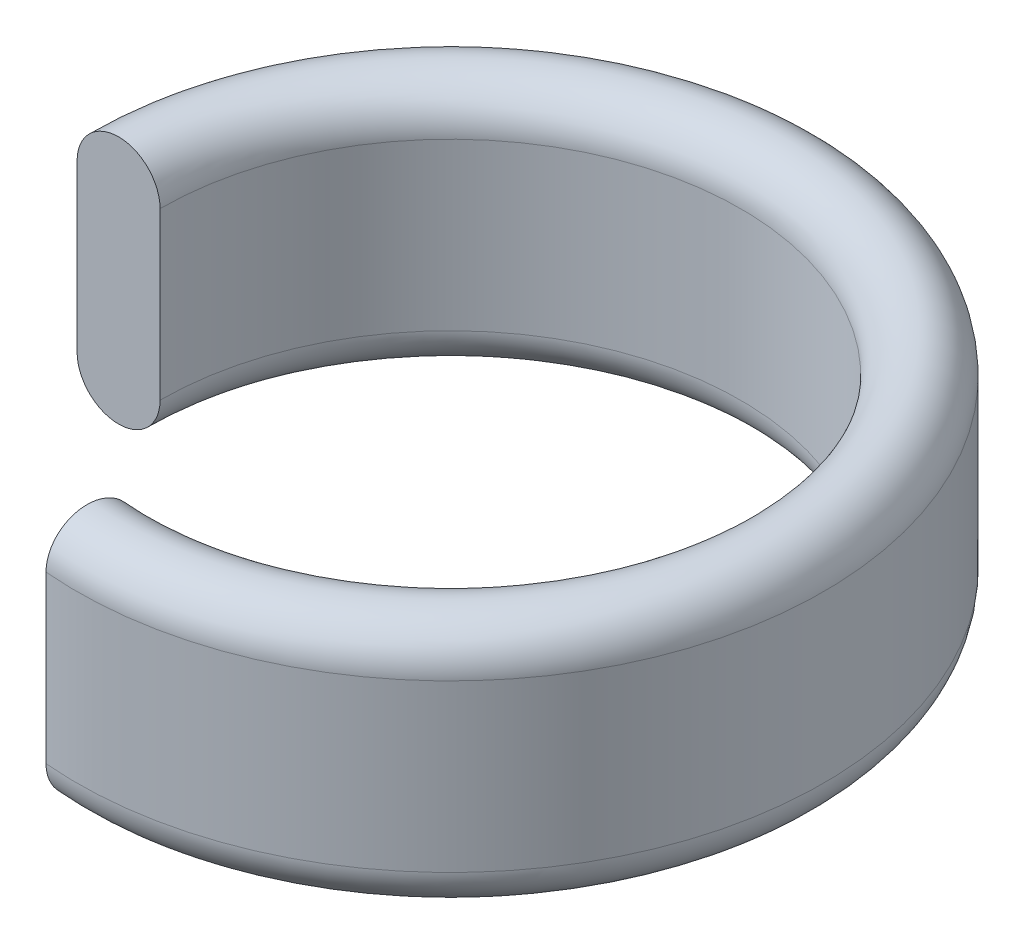
ISO-10303-21;
HEADER;
FILE_DESCRIPTION(('STEP AP214'),'2;1');
FILE_NAME('part.step','',(''),(''),'','','');
FILE_SCHEMA(('AUTOMOTIVE_DESIGN { 1 0 10303 214 1 1 1 1 }'));
ENDSEC;
DATA;
#1=APPLICATION_CONTEXT('core data for automotive mechanical design processes');
#2=APPLICATION_PROTOCOL_DEFINITION('international standard','automotive_design',2000,#1);
#3=PRODUCT_CONTEXT('',#1,'mechanical');
#4=PRODUCT('Part','Part','',(#3));
#5=PRODUCT_RELATED_PRODUCT_CATEGORY('part','',(#4));
#6=PRODUCT_DEFINITION_FORMATION('','',#4);
#7=PRODUCT_DEFINITION_CONTEXT('part definition',#1,'design');
#8=PRODUCT_DEFINITION('design','',#6,#7);
#9=PRODUCT_DEFINITION_SHAPE('','',#8);
#10=(LENGTH_UNIT() NAMED_UNIT(*) SI_UNIT(.MILLI.,.METRE.));
#11=(NAMED_UNIT(*) PLANE_ANGLE_UNIT() SI_UNIT($,.RADIAN.));
#12=(NAMED_UNIT(*) SI_UNIT($,.STERADIAN.) SOLID_ANGLE_UNIT());
#13=UNCERTAINTY_MEASURE_WITH_UNIT(LENGTH_MEASURE(1.E-05),#10,'distance_accuracy_value','');
#14=(GEOMETRIC_REPRESENTATION_CONTEXT(3) GLOBAL_UNCERTAINTY_ASSIGNED_CONTEXT((#13)) GLOBAL_UNIT_ASSIGNED_CONTEXT((#10,
#11,#12)) REPRESENTATION_CONTEXT('',''));
#15=CARTESIAN_POINT('',(0.,0.,0.));
#16=DIRECTION('',(0.,0.,1.));
#17=DIRECTION('',(1.,0.,0.));
#18=AXIS2_PLACEMENT_3D('',#15,#16,#17);
#19=CARTESIAN_POINT('',(0.,-5.,0.));
#20=DIRECTION('',(0.,1.,0.));
#21=DIRECTION('',(0.,0.,1.));
#22=AXIS2_PLACEMENT_3D('',#19,#20,#21);
#23=TOROIDAL_SURFACE('',#22,20.,2.5);
#24=CARTESIAN_POINT('',(0.,-5.,0.));
#25=DIRECTION('',(0.,1.,0.));
#26=DIRECTION('',(0.,0.,1.));
#27=AXIS2_PLACEMENT_3D('',#24,#25,#26);
#28=CIRCLE('',#27,22.5);
#29=CARTESIAN_POINT('',(-1.96100421182254,-5.,22.4143807070643));
#30=VERTEX_POINT('',#29);
#31=CARTESIAN_POINT('',(-22.5,-5.,0.));
#32=VERTEX_POINT('',#31);
#33=EDGE_CURVE('E13',#30,#32,#28,.T.);
#34=ORIENTED_EDGE('',*,*,#33,.F.);
#35=CARTESIAN_POINT('',(-1.74311485495337,-5.,19.9238939618349));
#36=DIRECTION('',(0.996194698091745,0.,0.0871557427476685));
#37=DIRECTION('',(-0.0871557427476685,0.,0.996194698091745));
#38=AXIS2_PLACEMENT_3D('',#35,#36,#37);
#39=CIRCLE('',#38,2.5);
#40=CARTESIAN_POINT('',(-1.5252254980842,-5.,17.4334072166055));
#41=VERTEX_POINT('',#40);
#42=EDGE_CURVE('E83',#30,#41,#39,.T.);
#43=ORIENTED_EDGE('',*,*,#42,.T.);
#44=CARTESIAN_POINT('',(0.,-5.,0.));
#45=DIRECTION('',(0.,1.,0.));
#46=DIRECTION('',(0.,0.,1.));
#47=AXIS2_PLACEMENT_3D('',#44,#45,#46);
#48=CIRCLE('',#47,17.5);
#49=CARTESIAN_POINT('',(-17.5,-5.,0.));
#50=VERTEX_POINT('',#49);
#51=EDGE_CURVE('E78',#41,#50,#48,.T.);
#52=ORIENTED_EDGE('',*,*,#51,.T.);
#53=CARTESIAN_POINT('',(-20.,-5.,0.));
#54=DIRECTION('',(0.,0.,1.));
#55=DIRECTION('',(-1.,0.,0.));
#56=AXIS2_PLACEMENT_3D('',#53,#54,#55);
#57=CIRCLE('',#56,2.5);
#58=EDGE_CURVE('E81',#32,#50,#57,.T.);
#59=ORIENTED_EDGE('',*,*,#58,.F.);
#60=EDGE_LOOP('',(#34,#43,#52,#59));
#61=FACE_BOUND('',#60,.T.);
#62=ADVANCED_FACE('F42',(#61),#23,.T.);
#63=CARTESIAN_POINT('',(0.,8.7572648493363,0.));
#64=DIRECTION('',(0.,1.,0.));
#65=DIRECTION('',(0.,0.,1.));
#66=AXIS2_PLACEMENT_3D('',#63,#64,#65);
#67=CYLINDRICAL_SURFACE('',#66,22.5);
#68=CARTESIAN_POINT('',(0.,5.,0.));
#69=DIRECTION('',(0.,1.,0.));
#70=DIRECTION('',(0.,0.,1.));
#71=AXIS2_PLACEMENT_3D('',#68,#69,#70);
#72=CIRCLE('',#71,22.5);
#73=CARTESIAN_POINT('',(-1.96100421182254,5.,22.4143807070643));
#74=VERTEX_POINT('',#73);
#75=CARTESIAN_POINT('',(-22.5,5.,0.));
#76=VERTEX_POINT('',#75);
#77=EDGE_CURVE('E50',#74,#76,#72,.T.);
#78=ORIENTED_EDGE('',*,*,#77,.F.);
#79=DIRECTION('',(0.,-1.,0.));
#80=VECTOR('',#79,1.);
#81=CARTESIAN_POINT('',(-1.96100421182254,-5.,22.4143807070643));
#82=LINE('',#81,#80);
#83=EDGE_CURVE('E88',#74,#30,#82,.T.);
#84=ORIENTED_EDGE('',*,*,#83,.T.);
#85=ORIENTED_EDGE('',*,*,#33,.T.);
#86=DIRECTION('',(0.,-1.,0.));
#87=VECTOR('',#86,1.);
#88=CARTESIAN_POINT('',(-22.5,-5.,0.));
#89=LINE('',#88,#87);
#90=EDGE_CURVE('E100',#76,#32,#89,.T.);
#91=ORIENTED_EDGE('',*,*,#90,.F.);
#92=EDGE_LOOP('',(#78,#84,#85,#91));
#93=FACE_BOUND('',#92,.T.);
#94=ADVANCED_FACE('F44',(#93),#67,.T.);
#95=CARTESIAN_POINT('',(0.,5.,0.));
#96=DIRECTION('',(0.,1.,0.));
#97=DIRECTION('',(0.,0.,1.));
#98=AXIS2_PLACEMENT_3D('',#95,#96,#97);
#99=TOROIDAL_SURFACE('',#98,20.,2.5);
#100=CARTESIAN_POINT('',(0.,5.,0.));
#101=DIRECTION('',(0.,1.,0.));
#102=DIRECTION('',(0.,0.,1.));
#103=AXIS2_PLACEMENT_3D('',#100,#101,#102);
#104=CIRCLE('',#103,17.5);
#105=CARTESIAN_POINT('',(-1.5252254980842,5.,17.4334072166055));
#106=VERTEX_POINT('',#105);
#107=CARTESIAN_POINT('',(-17.5,5.,0.));
#108=VERTEX_POINT('',#107);
#109=EDGE_CURVE('E87',#106,#108,#104,.T.);
#110=ORIENTED_EDGE('',*,*,#109,.F.);
#111=CARTESIAN_POINT('',(-1.74311485495337,5.,19.9238939618349));
#112=DIRECTION('',(0.996194698091745,0.,0.0871557427476685));
#113=DIRECTION('',(-0.0871557427476685,0.,0.996194698091745));
#114=AXIS2_PLACEMENT_3D('',#111,#112,#113);
#115=CIRCLE('',#114,2.5);
#116=EDGE_CURVE('E108',#106,#74,#115,.T.);
#117=ORIENTED_EDGE('',*,*,#116,.T.);
#118=ORIENTED_EDGE('',*,*,#77,.T.);
#119=CARTESIAN_POINT('',(-20.,5.,0.));
#120=DIRECTION('',(0.,0.,1.));
#121=DIRECTION('',(-1.,0.,0.));
#122=AXIS2_PLACEMENT_3D('',#119,#120,#121);
#123=CIRCLE('',#122,2.5);
#124=EDGE_CURVE('E96',#108,#76,#123,.T.);
#125=ORIENTED_EDGE('',*,*,#124,.F.);
#126=EDGE_LOOP('',(#110,#117,#118,#125));
#127=FACE_BOUND('',#126,.T.);
#128=ADVANCED_FACE('F112',(#127),#99,.T.);
#129=CARTESIAN_POINT('',(0.,8.7572648493363,0.));
#130=DIRECTION('',(0.,1.,0.));
#131=DIRECTION('',(0.,0.,1.));
#132=AXIS2_PLACEMENT_3D('',#129,#130,#131);
#133=CYLINDRICAL_SURFACE('',#132,17.5);
#134=DIRECTION('',(0.,1.,0.));
#135=VECTOR('',#134,1.);
#136=CARTESIAN_POINT('',(-1.5252254980842,-5.,17.4334072166055));
#137=LINE('',#136,#135);
#138=EDGE_CURVE('E106',#41,#106,#137,.T.);
#139=ORIENTED_EDGE('',*,*,#138,.T.);
#140=ORIENTED_EDGE('',*,*,#109,.T.);
#141=DIRECTION('',(0.,1.,0.));
#142=VECTOR('',#141,1.);
#143=CARTESIAN_POINT('',(-17.5,-5.,0.));
#144=LINE('',#143,#142);
#145=EDGE_CURVE('E91',#50,#108,#144,.T.);
#146=ORIENTED_EDGE('',*,*,#145,.F.);
#147=ORIENTED_EDGE('',*,*,#51,.F.);
#148=EDGE_LOOP('',(#139,#140,#146,#147));
#149=FACE_BOUND('',#148,.T.);
#150=ADVANCED_FACE('F92',(#149),#133,.F.);
#151=CARTESIAN_POINT('',(-1.74311485495337,-5.,19.9238939618349));
#152=DIRECTION('',(-0.996194698091745,0.,-0.0871557427476685));
#153=DIRECTION('',(-0.0871557427476685,0.,0.996194698091745));
#154=AXIS2_PLACEMENT_3D('',#151,#152,#153);
#155=PLANE('',#154);
#156=ORIENTED_EDGE('',*,*,#42,.F.);
#157=ORIENTED_EDGE('',*,*,#83,.F.);
#158=ORIENTED_EDGE('',*,*,#116,.F.);
#159=ORIENTED_EDGE('',*,*,#138,.F.);
#160=EDGE_LOOP('',(#156,#157,#158,#159));
#161=FACE_BOUND('',#160,.T.);
#162=ADVANCED_FACE('F116',(#161),#155,.T.);
#163=CARTESIAN_POINT('',(-20.,-5.,0.));
#164=DIRECTION('',(0.,0.,-1.));
#165=DIRECTION('',(-1.,0.,0.));
#166=AXIS2_PLACEMENT_3D('',#163,#164,#165);
#167=PLANE('',#166);
#168=ORIENTED_EDGE('',*,*,#58,.T.);
#169=ORIENTED_EDGE('',*,*,#145,.T.);
#170=ORIENTED_EDGE('',*,*,#124,.T.);
#171=ORIENTED_EDGE('',*,*,#90,.T.);
#172=EDGE_LOOP('',(#168,#169,#170,#171));
#173=FACE_BOUND('',#172,.T.);
#174=ADVANCED_FACE('F99',(#173),#167,.F.);
#175=CLOSED_SHELL('',(#62,#94,#128,#150,#162,#174));
#176=MANIFOLD_SOLID_BREP('B2',#175);
#177=ADVANCED_BREP_SHAPE_REPRESENTATION('',(#18,#176),#14);
#178=SHAPE_DEFINITION_REPRESENTATION(#9,#177);
ENDSEC;
END-ISO-10303-21;
